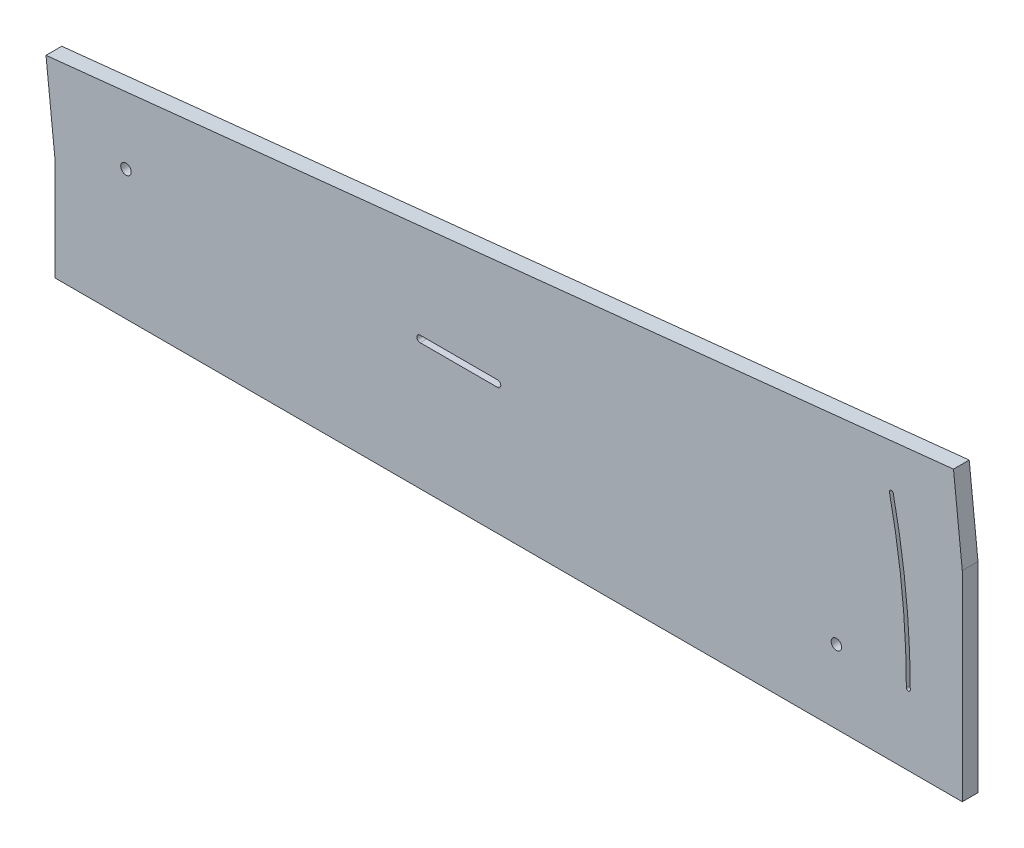
ISO-10303-21;
HEADER;
FILE_DESCRIPTION(('STEP AP214'),'2;1');
FILE_NAME('part.step','',(''),(''),'','','');
FILE_SCHEMA(('AUTOMOTIVE_DESIGN { 1 0 10303 214 1 1 1 1 }'));
ENDSEC;
DATA;
#1=APPLICATION_CONTEXT('core data for automotive mechanical design processes');
#2=APPLICATION_PROTOCOL_DEFINITION('international standard','automotive_design',2000,#1);
#3=PRODUCT_CONTEXT('',#1,'mechanical');
#4=PRODUCT('Part','Part','',(#3));
#5=PRODUCT_RELATED_PRODUCT_CATEGORY('part','',(#4));
#6=PRODUCT_DEFINITION_FORMATION('','',#4);
#7=PRODUCT_DEFINITION_CONTEXT('part definition',#1,'design');
#8=PRODUCT_DEFINITION('design','',#6,#7);
#9=PRODUCT_DEFINITION_SHAPE('','',#8);
#10=(LENGTH_UNIT() NAMED_UNIT(*) SI_UNIT(.MILLI.,.METRE.));
#11=(NAMED_UNIT(*) PLANE_ANGLE_UNIT() SI_UNIT($,.RADIAN.));
#12=(NAMED_UNIT(*) SI_UNIT($,.STERADIAN.) SOLID_ANGLE_UNIT());
#13=UNCERTAINTY_MEASURE_WITH_UNIT(LENGTH_MEASURE(1.E-05),#10,'distance_accuracy_value','');
#14=(GEOMETRIC_REPRESENTATION_CONTEXT(3) GLOBAL_UNCERTAINTY_ASSIGNED_CONTEXT((#13)) GLOBAL_UNIT_ASSIGNED_CONTEXT((#10,
#11,#12)) REPRESENTATION_CONTEXT('',''));
#15=CARTESIAN_POINT('',(0.,0.,0.));
#16=DIRECTION('',(0.,0.,1.));
#17=DIRECTION('',(1.,0.,0.));
#18=AXIS2_PLACEMENT_3D('',#15,#16,#17);
#19=CARTESIAN_POINT('',(0.,127.,19.05));
#20=DIRECTION('',(0.994521895368274,0.104528463267649,0.));
#21=DIRECTION('',(-0.104528463267649,0.994521895368274,0.));
#22=AXIS2_PLACEMENT_3D('',#19,#20,#21);
#23=PLANE('',#22);
#24=DIRECTION('',(0.104528463267649,-0.994521895368274,0.));
#25=VECTOR('',#24,1.);
#26=CARTESIAN_POINT('',(0.,127.,0.));
#27=LINE('',#26,#25);
#28=CARTESIAN_POINT('',(-10.6200918679931,228.043424569416,0.));
#29=VERTEX_POINT('',#28);
#30=CARTESIAN_POINT('',(0.,127.,0.));
#31=VERTEX_POINT('',#30);
#32=EDGE_CURVE('E229',#29,#31,#27,.T.);
#33=ORIENTED_EDGE('',*,*,#32,.T.);
#34=DIRECTION('',(0.,0.,-1.));
#35=VECTOR('',#34,1.);
#36=CARTESIAN_POINT('',(0.,127.,19.05));
#37=LINE('',#36,#35);
#38=CARTESIAN_POINT('',(0.,127.,19.05));
#39=VERTEX_POINT('',#38);
#40=EDGE_CURVE('E11',#39,#31,#37,.T.);
#41=ORIENTED_EDGE('',*,*,#40,.F.);
#42=DIRECTION('',(0.104528463267649,-0.994521895368274,0.));
#43=VECTOR('',#42,1.);
#44=CARTESIAN_POINT('',(0.,127.,19.05));
#45=LINE('',#44,#43);
#46=CARTESIAN_POINT('',(-10.6200918679931,228.043424569416,19.05));
#47=VERTEX_POINT('',#46);
#48=EDGE_CURVE('E245',#47,#39,#45,.T.);
#49=ORIENTED_EDGE('',*,*,#48,.F.);
#50=DIRECTION('',(0.,0.,-1.));
#51=VECTOR('',#50,1.);
#52=CARTESIAN_POINT('',(-10.6200918679931,228.043424569416,19.05));
#53=LINE('',#52,#51);
#54=EDGE_CURVE('E265',#47,#29,#53,.T.);
#55=ORIENTED_EDGE('',*,*,#54,.T.);
#56=EDGE_LOOP('',(#33,#41,#49,#55));
#57=FACE_BOUND('',#56,.T.);
#58=ADVANCED_FACE('F39',(#57),#23,.F.);
#59=CARTESIAN_POINT('',(0.,127.,19.05));
#60=DIRECTION('',(1.,0.,0.));
#61=DIRECTION('',(0.,1.,0.));
#62=AXIS2_PLACEMENT_3D('',#59,#60,#61);
#63=PLANE('',#62);
#64=DIRECTION('',(0.,-1.,0.));
#65=VECTOR('',#64,1.);
#66=CARTESIAN_POINT('',(0.,127.,0.));
#67=LINE('',#66,#65);
#68=CARTESIAN_POINT('',(0.,0.,0.));
#69=VERTEX_POINT('',#68);
#70=EDGE_CURVE('E269',#31,#69,#67,.T.);
#71=ORIENTED_EDGE('',*,*,#70,.T.);
#72=DIRECTION('',(0.,0.,-1.));
#73=VECTOR('',#72,1.);
#74=CARTESIAN_POINT('',(0.,0.,19.05));
#75=LINE('',#74,#73);
#76=CARTESIAN_POINT('',(0.,0.,19.05));
#77=VERTEX_POINT('',#76);
#78=EDGE_CURVE('E47',#77,#69,#75,.T.);
#79=ORIENTED_EDGE('',*,*,#78,.F.);
#80=DIRECTION('',(0.,-1.,0.));
#81=VECTOR('',#80,1.);
#82=CARTESIAN_POINT('',(0.,127.,19.05));
#83=LINE('',#82,#81);
#84=EDGE_CURVE('E249',#39,#77,#83,.T.);
#85=ORIENTED_EDGE('',*,*,#84,.F.);
#86=ORIENTED_EDGE('',*,*,#40,.T.);
#87=EDGE_LOOP('',(#71,#79,#85,#86));
#88=FACE_BOUND('',#87,.T.);
#89=ADVANCED_FACE('F325',(#88),#63,.F.);
#90=CARTESIAN_POINT('',(0.,0.,19.05));
#91=DIRECTION('',(0.,1.,0.));
#92=DIRECTION('',(0.,0.,1.));
#93=AXIS2_PLACEMENT_3D('',#90,#91,#92);
#94=PLANE('',#93);
#95=DIRECTION('',(1.,0.,0.));
#96=VECTOR('',#95,1.);
#97=CARTESIAN_POINT('',(0.,0.,0.));
#98=LINE('',#97,#96);
#99=CARTESIAN_POINT('',(1098.84724219241,0.,0.));
#100=VERTEX_POINT('',#99);
#101=EDGE_CURVE('E272',#69,#100,#98,.T.);
#102=ORIENTED_EDGE('',*,*,#101,.T.);
#103=DIRECTION('',(0.,0.,-1.));
#104=VECTOR('',#103,1.);
#105=CARTESIAN_POINT('',(1098.84724219241,0.,19.05));
#106=LINE('',#105,#104);
#107=CARTESIAN_POINT('',(1098.84724219241,0.,19.05));
#108=VERTEX_POINT('',#107);
#109=EDGE_CURVE('E294',#108,#100,#106,.T.);
#110=ORIENTED_EDGE('',*,*,#109,.F.);
#111=DIRECTION('',(1.,0.,0.));
#112=VECTOR('',#111,1.);
#113=CARTESIAN_POINT('',(0.,0.,19.05));
#114=LINE('',#113,#112);
#115=EDGE_CURVE('E253',#77,#108,#114,.T.);
#116=ORIENTED_EDGE('',*,*,#115,.F.);
#117=ORIENTED_EDGE('',*,*,#78,.T.);
#118=EDGE_LOOP('',(#102,#110,#116,#117));
#119=FACE_BOUND('',#118,.T.);
#120=ADVANCED_FACE('F303',(#119),#94,.F.);
#121=CARTESIAN_POINT('',(1098.84724219241,0.,19.05));
#122=DIRECTION('',(-1.,0.,0.));
#123=DIRECTION('',(0.,-1.,0.));
#124=AXIS2_PLACEMENT_3D('',#121,#122,#123);
#125=PLANE('',#124);
#126=DIRECTION('',(0.,1.,0.));
#127=VECTOR('',#126,1.);
#128=CARTESIAN_POINT('',(1098.84724219241,0.,0.));
#129=LINE('',#128,#127);
#130=CARTESIAN_POINT('',(1098.84724219241,242.493499064423,0.));
#131=VERTEX_POINT('',#130);
#132=EDGE_CURVE('E275',#100,#131,#129,.T.);
#133=ORIENTED_EDGE('',*,*,#132,.T.);
#134=DIRECTION('',(0.,0.,-1.));
#135=VECTOR('',#134,1.);
#136=CARTESIAN_POINT('',(1098.84724219241,242.493499064423,19.05));
#137=LINE('',#136,#135);
#138=CARTESIAN_POINT('',(1098.84724219241,242.493499064423,19.05));
#139=VERTEX_POINT('',#138);
#140=EDGE_CURVE('E290',#139,#131,#137,.T.);
#141=ORIENTED_EDGE('',*,*,#140,.F.);
#142=DIRECTION('',(0.,1.,0.));
#143=VECTOR('',#142,1.);
#144=CARTESIAN_POINT('',(1098.84724219241,0.,19.05));
#145=LINE('',#144,#143);
#146=EDGE_CURVE('E256',#108,#139,#145,.T.);
#147=ORIENTED_EDGE('',*,*,#146,.F.);
#148=ORIENTED_EDGE('',*,*,#109,.T.);
#149=EDGE_LOOP('',(#133,#141,#147,#148));
#150=FACE_BOUND('',#149,.T.);
#151=ADVANCED_FACE('F313',(#150),#125,.F.);
#152=CARTESIAN_POINT('',(1088.22715032441,343.536923633839,19.05));
#153=DIRECTION('',(-0.994521895368274,-0.104528463267642,0.));
#154=DIRECTION('',(0.104528463267642,-0.994521895368275,0.));
#155=AXIS2_PLACEMENT_3D('',#152,#153,#154);
#156=PLANE('',#155);
#157=DIRECTION('',(-0.104528463267642,0.994521895368275,0.));
#158=VECTOR('',#157,1.);
#159=CARTESIAN_POINT('',(1088.22715032441,343.536923633839,0.));
#160=LINE('',#159,#158);
#161=CARTESIAN_POINT('',(1088.22715032441,343.536923633839,0.));
#162=VERTEX_POINT('',#161);
#163=EDGE_CURVE('E278',#131,#162,#160,.T.);
#164=ORIENTED_EDGE('',*,*,#163,.T.);
#165=DIRECTION('',(0.,0.,-1.));
#166=VECTOR('',#165,1.);
#167=CARTESIAN_POINT('',(1088.22715032441,343.536923633839,19.05));
#168=LINE('',#167,#166);
#169=CARTESIAN_POINT('',(1088.22715032441,343.536923633839,19.05));
#170=VERTEX_POINT('',#169);
#171=EDGE_CURVE('E286',#170,#162,#168,.T.);
#172=ORIENTED_EDGE('',*,*,#171,.F.);
#173=DIRECTION('',(-0.104528463267642,0.994521895368275,0.));
#174=VECTOR('',#173,1.);
#175=CARTESIAN_POINT('',(1088.22715032441,343.536923633839,19.05));
#176=LINE('',#175,#174);
#177=EDGE_CURVE('E259',#139,#170,#176,.T.);
#178=ORIENTED_EDGE('',*,*,#177,.F.);
#179=ORIENTED_EDGE('',*,*,#140,.T.);
#180=EDGE_LOOP('',(#164,#172,#178,#179));
#181=FACE_BOUND('',#180,.T.);
#182=ADVANCED_FACE('F317',(#181),#156,.F.);
#183=CARTESIAN_POINT('',(-10.6200918679931,228.043424569416,19.05));
#184=DIRECTION('',(0.104528463267647,-0.994521895368274,0.));
#185=DIRECTION('',(0.994521895368274,0.104528463267647,0.));
#186=AXIS2_PLACEMENT_3D('',#183,#184,#185);
#187=PLANE('',#186);
#188=DIRECTION('',(-0.994521895368274,-0.104528463267647,0.));
#189=VECTOR('',#188,1.);
#190=CARTESIAN_POINT('',(-10.6200918679931,228.043424569416,0.));
#191=LINE('',#190,#189);
#192=EDGE_CURVE('E250',#162,#29,#191,.T.);
#193=ORIENTED_EDGE('',*,*,#192,.T.);
#194=ORIENTED_EDGE('',*,*,#54,.F.);
#195=DIRECTION('',(-0.994521895368274,-0.104528463267647,0.));
#196=VECTOR('',#195,1.);
#197=CARTESIAN_POINT('',(-10.6200918679931,228.043424569416,19.05));
#198=LINE('',#197,#196);
#199=EDGE_CURVE('E262',#170,#47,#198,.T.);
#200=ORIENTED_EDGE('',*,*,#199,.F.);
#201=ORIENTED_EDGE('',*,*,#171,.T.);
#202=EDGE_LOOP('',(#193,#194,#200,#201));
#203=FACE_BOUND('',#202,.T.);
#204=ADVANCED_FACE('F328',(#203),#187,.F.);
#205=CARTESIAN_POINT('',(0.,0.,19.05));
#206=DIRECTION('',(0.,0.,-1.));
#207=DIRECTION('',(-1.,0.,0.));
#208=AXIS2_PLACEMENT_3D('',#205,#206,#207);
#209=PLANE('',#208);
#210=CARTESIAN_POINT('',(946.447242192406,88.9,19.05));
#211=DIRECTION('',(0.,0.,1.));
#212=DIRECTION('',(1.,0.,0.));
#213=AXIS2_PLACEMENT_3D('',#210,#211,#212);
#214=CIRCLE('',#213,6.34999999999994);
#215=CARTESIAN_POINT('',(952.797242192406,88.9,19.05));
#216=VERTEX_POINT('',#215);
#217=EDGE_CURVE('E168',#216,#216,#214,.T.);
#218=ORIENTED_EDGE('',*,*,#217,.F.);
#219=EDGE_LOOP('',(#218));
#220=FACE_BOUND('',#219,.T.);
#221=CARTESIAN_POINT('',(93.7230424460677,85.7708681015491,19.05));
#222=DIRECTION('',(0.,0.,1.));
#223=DIRECTION('',(1.,0.,0.));
#224=AXIS2_PLACEMENT_3D('',#221,#222,#223);
#225=CIRCLE('',#224,942.181249986002);
#226=CARTESIAN_POINT('',(1035.90429243207,85.7708680997901,19.05));
#227=VERTEX_POINT('',#226);
#228=CARTESIAN_POINT('',(1015.31537157595,281.661364844353,19.05));
#229=VERTEX_POINT('',#228);
#230=EDGE_CURVE('E177',#227,#229,#225,.T.);
#231=ORIENTED_EDGE('',*,*,#230,.F.);
#232=CARTESIAN_POINT('',(1033.52304243207,85.7708680997943,19.05));
#233=DIRECTION('',(0.,0.,1.));
#234=DIRECTION('',(1.,0.,0.));
#235=AXIS2_PLACEMENT_3D('',#232,#233,#234);
#236=CIRCLE('',#235,2.38125);
#237=CARTESIAN_POINT('',(1031.14179243207,85.770868099799,19.05));
#238=VERTEX_POINT('',#237);
#239=EDGE_CURVE('E54',#238,#227,#236,.T.);
#240=ORIENTED_EDGE('',*,*,#239,.F.);
#241=CARTESIAN_POINT('',(93.7230424460677,85.7708681015491,19.05));
#242=DIRECTION('',(0.,0.,-1.));
#243=DIRECTION('',(1.,0.,0.));
#244=AXIS2_PLACEMENT_3D('',#241,#242,#243);
#245=CIRCLE('',#244,937.418749986002);
#246=CARTESIAN_POINT('',(1010.65694362746,280.671185416826,19.05));
#247=VERTEX_POINT('',#246);
#248=EDGE_CURVE('E161',#247,#238,#245,.T.);
#249=ORIENTED_EDGE('',*,*,#248,.F.);
#250=CARTESIAN_POINT('',(1012.9861576017,281.16627513059,19.05));
#251=DIRECTION('',(0.,0.,1.));
#252=DIRECTION('',(1.,0.,0.));
#253=AXIS2_PLACEMENT_3D('',#250,#251,#252);
#254=CIRCLE('',#253,2.38124999999997);
#255=EDGE_CURVE('E165',#229,#247,#254,.T.);
#256=ORIENTED_EDGE('',*,*,#255,.F.);
#257=EDGE_LOOP('',(#231,#240,#249,#256));
#258=FACE_BOUND('',#257,.T.);
#259=DIRECTION('',(1.,0.,0.));
#260=VECTOR('',#259,1.);
#261=CARTESIAN_POINT('',(442.415992192407,153.19375,19.05));
#262=LINE('',#261,#260);
#263=CARTESIAN_POINT('',(442.415992192407,153.19375,19.05));
#264=VERTEX_POINT('',#263);
#265=CARTESIAN_POINT('',(536.078492192406,153.19375,19.05));
#266=VERTEX_POINT('',#265);
#267=EDGE_CURVE('E214',#264,#266,#262,.T.);
#268=ORIENTED_EDGE('',*,*,#267,.F.);
#269=CARTESIAN_POINT('',(442.415992192407,157.1625,19.05));
#270=DIRECTION('',(0.,0.,1.));
#271=DIRECTION('',(1.,0.,0.));
#272=AXIS2_PLACEMENT_3D('',#269,#270,#271);
#273=CIRCLE('',#272,3.96874999999999);
#274=CARTESIAN_POINT('',(442.415992192407,161.13125,19.05));
#275=VERTEX_POINT('',#274);
#276=EDGE_CURVE('E211',#275,#264,#273,.T.);
#277=ORIENTED_EDGE('',*,*,#276,.F.);
#278=DIRECTION('',(-1.,0.,0.));
#279=VECTOR('',#278,1.);
#280=CARTESIAN_POINT('',(442.415992192407,161.13125,19.05));
#281=LINE('',#280,#279);
#282=CARTESIAN_POINT('',(536.078492192406,161.13125,19.05));
#283=VERTEX_POINT('',#282);
#284=EDGE_CURVE('E198',#283,#275,#281,.T.);
#285=ORIENTED_EDGE('',*,*,#284,.F.);
#286=CARTESIAN_POINT('',(536.078492192406,157.1625,19.05));
#287=DIRECTION('',(0.,0.,1.));
#288=DIRECTION('',(1.,0.,0.));
#289=AXIS2_PLACEMENT_3D('',#286,#287,#288);
#290=CIRCLE('',#289,3.96874999999999);
#291=EDGE_CURVE('E219',#266,#283,#290,.T.);
#292=ORIENTED_EDGE('',*,*,#291,.F.);
#293=EDGE_LOOP('',(#268,#277,#285,#292));
#294=FACE_BOUND('',#293,.T.);
#295=CARTESIAN_POINT('',(86.1972143573427,157.1625,19.05));
#296=DIRECTION('',(0.,0.,1.));
#297=DIRECTION('',(1.,0.,0.));
#298=AXIS2_PLACEMENT_3D('',#295,#296,#297);
#299=CIRCLE('',#298,6.34999999999999);
#300=CARTESIAN_POINT('',(92.5472143573427,157.1625,19.05));
#301=VERTEX_POINT('',#300);
#302=EDGE_CURVE('E187',#301,#301,#299,.T.);
#303=ORIENTED_EDGE('',*,*,#302,.F.);
#304=EDGE_LOOP('',(#303));
#305=FACE_BOUND('',#304,.T.);
#306=ORIENTED_EDGE('',*,*,#48,.T.);
#307=ORIENTED_EDGE('',*,*,#84,.T.);
#308=ORIENTED_EDGE('',*,*,#115,.T.);
#309=ORIENTED_EDGE('',*,*,#146,.T.);
#310=ORIENTED_EDGE('',*,*,#177,.T.);
#311=ORIENTED_EDGE('',*,*,#199,.T.);
#312=EDGE_LOOP('',(#306,#307,#308,#309,#310,#311));
#313=FACE_BOUND('',#312,.T.);
#314=ADVANCED_FACE('F321',(#220,#258,#294,#305,#313),#209,.F.);
#315=CARTESIAN_POINT('',(0.,0.,0.));
#316=DIRECTION('',(0.,0.,-1.));
#317=DIRECTION('',(-1.,0.,0.));
#318=AXIS2_PLACEMENT_3D('',#315,#316,#317);
#319=PLANE('',#318);
#320=CARTESIAN_POINT('',(946.447242192406,88.9,0.));
#321=DIRECTION('',(0.,0.,1.));
#322=DIRECTION('',(1.,0.,0.));
#323=AXIS2_PLACEMENT_3D('',#320,#321,#322);
#324=CIRCLE('',#323,6.34999999999994);
#325=CARTESIAN_POINT('',(952.797242192406,88.9,0.));
#326=VERTEX_POINT('',#325);
#327=EDGE_CURVE('E178',#326,#326,#324,.T.);
#328=ORIENTED_EDGE('',*,*,#327,.T.);
#329=EDGE_LOOP('',(#328));
#330=FACE_BOUND('',#329,.T.);
#331=CARTESIAN_POINT('',(1033.52304243207,85.7708680997943,0.));
#332=DIRECTION('',(0.,0.,1.));
#333=DIRECTION('',(1.,0.,0.));
#334=AXIS2_PLACEMENT_3D('',#331,#332,#333);
#335=CIRCLE('',#334,2.38125);
#336=CARTESIAN_POINT('',(1031.14179243207,85.770868099799,0.));
#337=VERTEX_POINT('',#336);
#338=CARTESIAN_POINT('',(1035.90429243207,85.7708680997901,0.));
#339=VERTEX_POINT('',#338);
#340=EDGE_CURVE('E142',#337,#339,#335,.T.);
#341=ORIENTED_EDGE('',*,*,#340,.T.);
#342=CARTESIAN_POINT('',(93.7230424460677,85.7708681015491,0.));
#343=DIRECTION('',(0.,0.,1.));
#344=DIRECTION('',(1.,0.,0.));
#345=AXIS2_PLACEMENT_3D('',#342,#343,#344);
#346=CIRCLE('',#345,942.181249986002);
#347=CARTESIAN_POINT('',(1015.31537157595,281.661364844353,0.));
#348=VERTEX_POINT('',#347);
#349=EDGE_CURVE('E152',#339,#348,#346,.T.);
#350=ORIENTED_EDGE('',*,*,#349,.T.);
#351=CARTESIAN_POINT('',(1012.9861576017,281.16627513059,0.));
#352=DIRECTION('',(0.,0.,1.));
#353=DIRECTION('',(1.,0.,0.));
#354=AXIS2_PLACEMENT_3D('',#351,#352,#353);
#355=CIRCLE('',#354,2.38124999999997);
#356=CARTESIAN_POINT('',(1010.65694362746,280.671185416826,0.));
#357=VERTEX_POINT('',#356);
#358=EDGE_CURVE('E62',#348,#357,#355,.T.);
#359=ORIENTED_EDGE('',*,*,#358,.T.);
#360=CARTESIAN_POINT('',(93.7230424460677,85.7708681015491,0.));
#361=DIRECTION('',(0.,0.,-1.));
#362=DIRECTION('',(1.,0.,0.));
#363=AXIS2_PLACEMENT_3D('',#360,#361,#362);
#364=CIRCLE('',#363,937.418749986002);
#365=EDGE_CURVE('E149',#357,#337,#364,.T.);
#366=ORIENTED_EDGE('',*,*,#365,.T.);
#367=EDGE_LOOP('',(#341,#350,#359,#366));
#368=FACE_BOUND('',#367,.T.);
#369=CARTESIAN_POINT('',(442.415992192407,157.1625,0.));
#370=DIRECTION('',(0.,0.,1.));
#371=DIRECTION('',(1.,0.,0.));
#372=AXIS2_PLACEMENT_3D('',#369,#370,#371);
#373=CIRCLE('',#372,3.96874999999999);
#374=CARTESIAN_POINT('',(442.415992192407,161.13125,0.));
#375=VERTEX_POINT('',#374);
#376=CARTESIAN_POINT('',(442.415992192407,153.19375,0.));
#377=VERTEX_POINT('',#376);
#378=EDGE_CURVE('E193',#375,#377,#373,.T.);
#379=ORIENTED_EDGE('',*,*,#378,.T.);
#380=DIRECTION('',(1.,0.,0.));
#381=VECTOR('',#380,1.);
#382=CARTESIAN_POINT('',(442.415992192407,153.19375,0.));
#383=LINE('',#382,#381);
#384=CARTESIAN_POINT('',(536.078492192406,153.19375,0.));
#385=VERTEX_POINT('',#384);
#386=EDGE_CURVE('E197',#377,#385,#383,.T.);
#387=ORIENTED_EDGE('',*,*,#386,.T.);
#388=CARTESIAN_POINT('',(536.078492192406,157.1625,0.));
#389=DIRECTION('',(0.,0.,1.));
#390=DIRECTION('',(1.,0.,0.));
#391=AXIS2_PLACEMENT_3D('',#388,#389,#390);
#392=CIRCLE('',#391,3.96874999999999);
#393=CARTESIAN_POINT('',(536.078492192406,161.13125,0.));
#394=VERTEX_POINT('',#393);
#395=EDGE_CURVE('E202',#385,#394,#392,.T.);
#396=ORIENTED_EDGE('',*,*,#395,.T.);
#397=DIRECTION('',(-1.,0.,0.));
#398=VECTOR('',#397,1.);
#399=CARTESIAN_POINT('',(442.415992192407,161.13125,0.));
#400=LINE('',#399,#398);
#401=EDGE_CURVE('E206',#394,#375,#400,.T.);
#402=ORIENTED_EDGE('',*,*,#401,.T.);
#403=EDGE_LOOP('',(#379,#387,#396,#402));
#404=FACE_BOUND('',#403,.T.);
#405=CARTESIAN_POINT('',(86.1972143573427,157.1625,0.));
#406=DIRECTION('',(0.,0.,1.));
#407=DIRECTION('',(1.,0.,0.));
#408=AXIS2_PLACEMENT_3D('',#405,#406,#407);
#409=CIRCLE('',#408,6.34999999999999);
#410=CARTESIAN_POINT('',(92.5472143573427,157.1625,0.));
#411=VERTEX_POINT('',#410);
#412=EDGE_CURVE('E215',#411,#411,#409,.T.);
#413=ORIENTED_EDGE('',*,*,#412,.T.);
#414=EDGE_LOOP('',(#413));
#415=FACE_BOUND('',#414,.T.);
#416=ORIENTED_EDGE('',*,*,#32,.F.);
#417=ORIENTED_EDGE('',*,*,#192,.F.);
#418=ORIENTED_EDGE('',*,*,#163,.F.);
#419=ORIENTED_EDGE('',*,*,#132,.F.);
#420=ORIENTED_EDGE('',*,*,#101,.F.);
#421=ORIENTED_EDGE('',*,*,#70,.F.);
#422=EDGE_LOOP('',(#416,#417,#418,#419,#420,#421));
#423=FACE_BOUND('',#422,.T.);
#424=ADVANCED_FACE('F157',(#330,#368,#404,#415,#423),#319,.T.);
#425=CARTESIAN_POINT('',(86.1972143573427,157.1625,0.));
#426=DIRECTION('',(0.,0.,1.));
#427=DIRECTION('',(1.,0.,0.));
#428=AXIS2_PLACEMENT_3D('',#425,#426,#427);
#429=CYLINDRICAL_SURFACE('',#428,6.34999999999999);
#430=CARTESIAN_POINT('',(92.5472143573427,157.1625,0.));
#431=CARTESIAN_POINT('',(92.5472143573427,157.1625,0.1984375));
#432=CARTESIAN_POINT('',(92.5472143573427,157.1625,0.396875));
#433=CARTESIAN_POINT('',(92.5472143573427,157.1625,0.79375));
#434=CARTESIAN_POINT('',(92.5472143573427,157.1625,0.9921875));
#435=CARTESIAN_POINT('',(92.5472143573427,157.1625,1.3890625));
#436=CARTESIAN_POINT('',(92.5472143573427,157.1625,1.5875));
#437=CARTESIAN_POINT('',(92.5472143573427,157.1625,1.984375));
#438=CARTESIAN_POINT('',(92.5472143573427,157.1625,2.1828125));
#439=CARTESIAN_POINT('',(92.5472143573427,157.1625,2.5796875));
#440=CARTESIAN_POINT('',(92.5472143573427,157.1625,2.778125));
#441=CARTESIAN_POINT('',(92.5472143573427,157.1625,3.175));
#442=CARTESIAN_POINT('',(92.5472143573427,157.1625,3.3734375));
#443=CARTESIAN_POINT('',(92.5472143573427,157.1625,3.7703125));
#444=CARTESIAN_POINT('',(92.5472143573427,157.1625,3.96875));
#445=CARTESIAN_POINT('',(92.5472143573427,157.1625,4.365625));
#446=CARTESIAN_POINT('',(92.5472143573427,157.1625,4.5640625));
#447=CARTESIAN_POINT('',(92.5472143573427,157.1625,4.9609375));
#448=CARTESIAN_POINT('',(92.5472143573427,157.1625,5.159375));
#449=CARTESIAN_POINT('',(92.5472143573427,157.1625,5.55625));
#450=CARTESIAN_POINT('',(92.5472143573427,157.1625,5.7546875));
#451=CARTESIAN_POINT('',(92.5472143573427,157.1625,6.1515625));
#452=CARTESIAN_POINT('',(92.5472143573427,157.1625,6.35));
#453=CARTESIAN_POINT('',(92.5472143573427,157.1625,6.746875));
#454=CARTESIAN_POINT('',(92.5472143573427,157.1625,6.9453125));
#455=CARTESIAN_POINT('',(92.5472143573427,157.1625,7.3421875));
#456=CARTESIAN_POINT('',(92.5472143573427,157.1625,7.540625));
#457=CARTESIAN_POINT('',(92.5472143573427,157.1625,7.9375));
#458=CARTESIAN_POINT('',(92.5472143573427,157.1625,8.1359375));
#459=CARTESIAN_POINT('',(92.5472143573427,157.1625,8.5328125));
#460=CARTESIAN_POINT('',(92.5472143573427,157.1625,8.73125));
#461=CARTESIAN_POINT('',(92.5472143573427,157.1625,9.128125));
#462=CARTESIAN_POINT('',(92.5472143573427,157.1625,9.3265625));
#463=CARTESIAN_POINT('',(92.5472143573427,157.1625,9.7234375));
#464=CARTESIAN_POINT('',(92.5472143573427,157.1625,9.921875));
#465=CARTESIAN_POINT('',(92.5472143573427,157.1625,10.31875));
#466=CARTESIAN_POINT('',(92.5472143573427,157.1625,10.5171875));
#467=CARTESIAN_POINT('',(92.5472143573427,157.1625,10.9140625));
#468=CARTESIAN_POINT('',(92.5472143573427,157.1625,11.1125));
#469=CARTESIAN_POINT('',(92.5472143573427,157.1625,11.509375));
#470=CARTESIAN_POINT('',(92.5472143573427,157.1625,11.7078125));
#471=CARTESIAN_POINT('',(92.5472143573427,157.1625,12.1046875));
#472=CARTESIAN_POINT('',(92.5472143573427,157.1625,12.303125));
#473=CARTESIAN_POINT('',(92.5472143573427,157.1625,12.7));
#474=CARTESIAN_POINT('',(92.5472143573427,157.1625,12.8984375));
#475=CARTESIAN_POINT('',(92.5472143573427,157.1625,13.2953125));
#476=CARTESIAN_POINT('',(92.5472143573427,157.1625,13.49375));
#477=CARTESIAN_POINT('',(92.5472143573427,157.1625,13.890625));
#478=CARTESIAN_POINT('',(92.5472143573427,157.1625,14.0890625));
#479=CARTESIAN_POINT('',(92.5472143573427,157.1625,14.4859375));
#480=CARTESIAN_POINT('',(92.5472143573427,157.1625,14.684375));
#481=CARTESIAN_POINT('',(92.5472143573427,157.1625,15.08125));
#482=CARTESIAN_POINT('',(92.5472143573427,157.1625,15.2796875));
#483=CARTESIAN_POINT('',(92.5472143573427,157.1625,15.6765625));
#484=CARTESIAN_POINT('',(92.5472143573427,157.1625,15.875));
#485=CARTESIAN_POINT('',(92.5472143573427,157.1625,16.271875));
#486=CARTESIAN_POINT('',(92.5472143573427,157.1625,16.4703125));
#487=CARTESIAN_POINT('',(92.5472143573427,157.1625,16.8671875));
#488=CARTESIAN_POINT('',(92.5472143573427,157.1625,17.065625));
#489=CARTESIAN_POINT('',(92.5472143573427,157.1625,17.4625));
#490=CARTESIAN_POINT('',(92.5472143573427,157.1625,17.6609375));
#491=CARTESIAN_POINT('',(92.5472143573427,157.1625,18.0578125));
#492=CARTESIAN_POINT('',(92.5472143573427,157.1625,18.25625));
#493=CARTESIAN_POINT('',(92.5472143573427,157.1625,18.653125));
#494=CARTESIAN_POINT('',(92.5472143573427,157.1625,18.8515625));
#495=CARTESIAN_POINT('',(92.5472143573427,157.1625,19.05));
#496=B_SPLINE_CURVE_WITH_KNOTS('',3,(#430,#431,#432,#433,#434,#435,#436,#437,#438,#439,#440,
#441,#442,#443,#444,#445,#446,#447,#448,#449,#450,#451,#452,#453,#454,#455,#456,#457,#458,#459,
#460,#461,#462,#463,#464,#465,#466,#467,#468,#469,#470,#471,#472,#473,#474,#475,#476,#477,#478,
#479,#480,#481,#482,#483,#484,#485,#486,#487,#488,#489,#490,#491,#492,#493,#494,#495),
.UNSPECIFIED.,.F.,.F.,(4,2,2,2,2,2,2,2,2,2,2,2,2,2,2,2,2,2,2,2,2,2,2,2,2,2,2,2,2,2,2,2,4),(0.,
0.5953125,1.190625,1.7859375,2.38125,2.9765625,3.571875,4.1671875,4.7625,5.3578125,5.953125,
6.5484375,7.14375,7.7390625,8.334375,8.9296875,9.525,10.1203125,10.715625,11.3109375,11.90625,
12.5015625,13.096875,13.6921875,14.2875,14.8828125,15.478125,16.0734375,16.66875,17.2640625,
17.859375,18.4546875,19.05),.UNSPECIFIED.);
#497=EDGE_CURVE('BSEAM367',#411,#301,#496,.T.);
#498=ORIENTED_EDGE('',*,*,#412,.F.);
#499=ORIENTED_EDGE('',*,*,#302,.T.);
#500=ORIENTED_EDGE('',*,*,#497,.T.);
#501=ORIENTED_EDGE('',*,*,#497,.F.);
#502=EDGE_LOOP('',(#498,#500,#499,#501));
#503=FACE_BOUND('',#502,.T.);
#504=ADVANCED_FACE('F367',(#503),#429,.F.);
#505=CARTESIAN_POINT('',(442.415992192407,157.1625,0.));
#506=DIRECTION('',(0.,0.,1.));
#507=DIRECTION('',(1.,0.,0.));
#508=AXIS2_PLACEMENT_3D('',#505,#506,#507);
#509=CYLINDRICAL_SURFACE('',#508,3.96874999999999);
#510=ORIENTED_EDGE('',*,*,#276,.T.);
#511=DIRECTION('',(0.,0.,1.));
#512=VECTOR('',#511,1.);
#513=CARTESIAN_POINT('',(442.415992192407,153.19375,0.));
#514=LINE('',#513,#512);
#515=EDGE_CURVE('E210',#377,#264,#514,.T.);
#516=ORIENTED_EDGE('',*,*,#515,.F.);
#517=ORIENTED_EDGE('',*,*,#378,.F.);
#518=DIRECTION('',(0.,0.,1.));
#519=VECTOR('',#518,1.);
#520=CARTESIAN_POINT('',(442.415992192407,161.13125,0.));
#521=LINE('',#520,#519);
#522=EDGE_CURVE('E226',#375,#275,#521,.T.);
#523=ORIENTED_EDGE('',*,*,#522,.T.);
#524=EDGE_LOOP('',(#510,#516,#517,#523));
#525=FACE_BOUND('',#524,.T.);
#526=ADVANCED_FACE('F372',(#525),#509,.F.);
#527=CARTESIAN_POINT('',(442.415992192407,161.13125,0.));
#528=DIRECTION('',(0.,1.,0.));
#529=DIRECTION('',(0.,0.,1.));
#530=AXIS2_PLACEMENT_3D('',#527,#528,#529);
#531=PLANE('',#530);
#532=ORIENTED_EDGE('',*,*,#284,.T.);
#533=ORIENTED_EDGE('',*,*,#522,.F.);
#534=ORIENTED_EDGE('',*,*,#401,.F.);
#535=DIRECTION('',(0.,0.,1.));
#536=VECTOR('',#535,1.);
#537=CARTESIAN_POINT('',(536.078492192406,161.13125,0.));
#538=LINE('',#537,#536);
#539=EDGE_CURVE('E230',#394,#283,#538,.T.);
#540=ORIENTED_EDGE('',*,*,#539,.T.);
#541=EDGE_LOOP('',(#532,#533,#534,#540));
#542=FACE_BOUND('',#541,.T.);
#543=ADVANCED_FACE('F384',(#542),#531,.F.);
#544=CARTESIAN_POINT('',(536.078492192406,157.1625,0.));
#545=DIRECTION('',(0.,0.,1.));
#546=DIRECTION('',(1.,0.,0.));
#547=AXIS2_PLACEMENT_3D('',#544,#545,#546);
#548=CYLINDRICAL_SURFACE('',#547,3.96874999999999);
#549=ORIENTED_EDGE('',*,*,#291,.T.);
#550=ORIENTED_EDGE('',*,*,#539,.F.);
#551=ORIENTED_EDGE('',*,*,#395,.F.);
#552=DIRECTION('',(0.,0.,1.));
#553=VECTOR('',#552,1.);
#554=CARTESIAN_POINT('',(536.078492192406,153.19375,0.));
#555=LINE('',#554,#553);
#556=EDGE_CURVE('E233',#385,#266,#555,.T.);
#557=ORIENTED_EDGE('',*,*,#556,.T.);
#558=EDGE_LOOP('',(#549,#550,#551,#557));
#559=FACE_BOUND('',#558,.T.);
#560=ADVANCED_FACE('F394',(#559),#548,.F.);
#561=CARTESIAN_POINT('',(442.415992192407,153.19375,0.));
#562=DIRECTION('',(0.,-1.,0.));
#563=DIRECTION('',(0.,0.,-1.));
#564=AXIS2_PLACEMENT_3D('',#561,#562,#563);
#565=PLANE('',#564);
#566=ORIENTED_EDGE('',*,*,#267,.T.);
#567=ORIENTED_EDGE('',*,*,#556,.F.);
#568=ORIENTED_EDGE('',*,*,#386,.F.);
#569=ORIENTED_EDGE('',*,*,#515,.T.);
#570=EDGE_LOOP('',(#566,#567,#568,#569));
#571=FACE_BOUND('',#570,.T.);
#572=ADVANCED_FACE('F404',(#571),#565,.F.);
#573=CARTESIAN_POINT('',(1033.52304243207,85.7708680997943,0.));
#574=DIRECTION('',(0.,0.,1.));
#575=DIRECTION('',(1.,0.,0.));
#576=AXIS2_PLACEMENT_3D('',#573,#574,#575);
#577=CYLINDRICAL_SURFACE('',#576,2.38125);
#578=ORIENTED_EDGE('',*,*,#239,.T.);
#579=DIRECTION('',(0.,0.,1.));
#580=VECTOR('',#579,1.);
#581=CARTESIAN_POINT('',(1035.90429243207,85.7708680997901,0.));
#582=LINE('',#581,#580);
#583=EDGE_CURVE('E138',#339,#227,#582,.T.);
#584=ORIENTED_EDGE('',*,*,#583,.F.);
#585=ORIENTED_EDGE('',*,*,#340,.F.);
#586=DIRECTION('',(0.,0.,1.));
#587=VECTOR('',#586,1.);
#588=CARTESIAN_POINT('',(1031.14179243207,85.770868099799,0.));
#589=LINE('',#588,#587);
#590=EDGE_CURVE('E184',#337,#238,#589,.T.);
#591=ORIENTED_EDGE('',*,*,#590,.T.);
#592=EDGE_LOOP('',(#578,#584,#585,#591));
#593=FACE_BOUND('',#592,.T.);
#594=ADVANCED_FACE('F140',(#593),#577,.F.);
#595=CARTESIAN_POINT('',(93.7230424460677,85.7708681015491,0.));
#596=DIRECTION('',(0.,0.,1.));
#597=DIRECTION('',(1.,0.,0.));
#598=AXIS2_PLACEMENT_3D('',#595,#596,#597);
#599=CYLINDRICAL_SURFACE('',#598,937.418749986002);
#600=ORIENTED_EDGE('',*,*,#248,.T.);
#601=ORIENTED_EDGE('',*,*,#590,.F.);
#602=ORIENTED_EDGE('',*,*,#365,.F.);
#603=DIRECTION('',(0.,0.,1.));
#604=VECTOR('',#603,1.);
#605=CARTESIAN_POINT('',(1010.65694362746,280.671185416826,0.));
#606=LINE('',#605,#604);
#607=EDGE_CURVE('E188',#357,#247,#606,.T.);
#608=ORIENTED_EDGE('',*,*,#607,.T.);
#609=EDGE_LOOP('',(#600,#601,#602,#608));
#610=FACE_BOUND('',#609,.T.);
#611=ADVANCED_FACE('F423',(#610),#599,.T.);
#612=CARTESIAN_POINT('',(1012.9861576017,281.16627513059,0.));
#613=DIRECTION('',(0.,0.,1.));
#614=DIRECTION('',(1.,0.,0.));
#615=AXIS2_PLACEMENT_3D('',#612,#613,#614);
#616=CYLINDRICAL_SURFACE('',#615,2.38124999999997);
#617=ORIENTED_EDGE('',*,*,#255,.T.);
#618=ORIENTED_EDGE('',*,*,#607,.F.);
#619=ORIENTED_EDGE('',*,*,#358,.F.);
#620=DIRECTION('',(0.,0.,1.));
#621=VECTOR('',#620,1.);
#622=CARTESIAN_POINT('',(1015.31537157595,281.661364844353,0.));
#623=LINE('',#622,#621);
#624=EDGE_CURVE('E148',#348,#229,#623,.T.);
#625=ORIENTED_EDGE('',*,*,#624,.T.);
#626=EDGE_LOOP('',(#617,#618,#619,#625));
#627=FACE_BOUND('',#626,.T.);
#628=ADVANCED_FACE('F432',(#627),#616,.F.);
#629=CARTESIAN_POINT('',(93.7230424460677,85.7708681015491,0.));
#630=DIRECTION('',(0.,0.,1.));
#631=DIRECTION('',(1.,0.,0.));
#632=AXIS2_PLACEMENT_3D('',#629,#630,#631);
#633=CYLINDRICAL_SURFACE('',#632,942.181249986002);
#634=ORIENTED_EDGE('',*,*,#230,.T.);
#635=ORIENTED_EDGE('',*,*,#624,.F.);
#636=ORIENTED_EDGE('',*,*,#349,.F.);
#637=ORIENTED_EDGE('',*,*,#583,.T.);
#638=EDGE_LOOP('',(#634,#635,#636,#637));
#639=FACE_BOUND('',#638,.T.);
#640=ADVANCED_FACE('F153',(#639),#633,.F.);
#641=CARTESIAN_POINT('',(946.447242192406,88.9,0.));
#642=DIRECTION('',(0.,0.,1.));
#643=DIRECTION('',(1.,0.,0.));
#644=AXIS2_PLACEMENT_3D('',#641,#642,#643);
#645=CYLINDRICAL_SURFACE('',#644,6.34999999999994);
#646=CARTESIAN_POINT('',(952.797242192406,88.9,0.));
#647=CARTESIAN_POINT('',(952.797242192406,88.9,0.1984375));
#648=CARTESIAN_POINT('',(952.797242192406,88.9,0.396875));
#649=CARTESIAN_POINT('',(952.797242192406,88.9,0.79375));
#650=CARTESIAN_POINT('',(952.797242192406,88.9,0.9921875));
#651=CARTESIAN_POINT('',(952.797242192406,88.9,1.3890625));
#652=CARTESIAN_POINT('',(952.797242192406,88.9,1.5875));
#653=CARTESIAN_POINT('',(952.797242192406,88.9,1.984375));
#654=CARTESIAN_POINT('',(952.797242192406,88.9,2.1828125));
#655=CARTESIAN_POINT('',(952.797242192406,88.9,2.5796875));
#656=CARTESIAN_POINT('',(952.797242192406,88.9,2.778125));
#657=CARTESIAN_POINT('',(952.797242192406,88.9,3.175));
#658=CARTESIAN_POINT('',(952.797242192406,88.9,3.3734375));
#659=CARTESIAN_POINT('',(952.797242192406,88.9,3.7703125));
#660=CARTESIAN_POINT('',(952.797242192406,88.9,3.96875));
#661=CARTESIAN_POINT('',(952.797242192406,88.9,4.365625));
#662=CARTESIAN_POINT('',(952.797242192406,88.9,4.5640625));
#663=CARTESIAN_POINT('',(952.797242192406,88.9,4.9609375));
#664=CARTESIAN_POINT('',(952.797242192406,88.9,5.159375));
#665=CARTESIAN_POINT('',(952.797242192406,88.9,5.55625));
#666=CARTESIAN_POINT('',(952.797242192406,88.9,5.7546875));
#667=CARTESIAN_POINT('',(952.797242192406,88.9,6.1515625));
#668=CARTESIAN_POINT('',(952.797242192406,88.9,6.35));
#669=CARTESIAN_POINT('',(952.797242192406,88.9,6.746875));
#670=CARTESIAN_POINT('',(952.797242192406,88.9,6.9453125));
#671=CARTESIAN_POINT('',(952.797242192406,88.9,7.3421875));
#672=CARTESIAN_POINT('',(952.797242192406,88.9,7.540625));
#673=CARTESIAN_POINT('',(952.797242192406,88.9,7.9375));
#674=CARTESIAN_POINT('',(952.797242192406,88.9,8.1359375));
#675=CARTESIAN_POINT('',(952.797242192406,88.9,8.5328125));
#676=CARTESIAN_POINT('',(952.797242192406,88.9,8.73125));
#677=CARTESIAN_POINT('',(952.797242192406,88.9,9.128125));
#678=CARTESIAN_POINT('',(952.797242192406,88.9,9.3265625));
#679=CARTESIAN_POINT('',(952.797242192406,88.9,9.7234375));
#680=CARTESIAN_POINT('',(952.797242192406,88.9,9.921875));
#681=CARTESIAN_POINT('',(952.797242192406,88.9,10.31875));
#682=CARTESIAN_POINT('',(952.797242192406,88.9,10.5171875));
#683=CARTESIAN_POINT('',(952.797242192406,88.9,10.9140625));
#684=CARTESIAN_POINT('',(952.797242192406,88.9,11.1125));
#685=CARTESIAN_POINT('',(952.797242192406,88.9,11.509375));
#686=CARTESIAN_POINT('',(952.797242192406,88.9,11.7078125));
#687=CARTESIAN_POINT('',(952.797242192406,88.9,12.1046875));
#688=CARTESIAN_POINT('',(952.797242192406,88.9,12.303125));
#689=CARTESIAN_POINT('',(952.797242192406,88.9,12.7));
#690=CARTESIAN_POINT('',(952.797242192406,88.9,12.8984375));
#691=CARTESIAN_POINT('',(952.797242192406,88.9,13.2953125));
#692=CARTESIAN_POINT('',(952.797242192406,88.9,13.49375));
#693=CARTESIAN_POINT('',(952.797242192406,88.9,13.890625));
#694=CARTESIAN_POINT('',(952.797242192406,88.9,14.0890625));
#695=CARTESIAN_POINT('',(952.797242192406,88.9,14.4859375));
#696=CARTESIAN_POINT('',(952.797242192406,88.9,14.684375));
#697=CARTESIAN_POINT('',(952.797242192406,88.9,15.08125));
#698=CARTESIAN_POINT('',(952.797242192406,88.9,15.2796875));
#699=CARTESIAN_POINT('',(952.797242192406,88.9,15.6765625));
#700=CARTESIAN_POINT('',(952.797242192406,88.9,15.875));
#701=CARTESIAN_POINT('',(952.797242192406,88.9,16.271875));
#702=CARTESIAN_POINT('',(952.797242192406,88.9,16.4703125));
#703=CARTESIAN_POINT('',(952.797242192406,88.9,16.8671875));
#704=CARTESIAN_POINT('',(952.797242192406,88.9,17.065625));
#705=CARTESIAN_POINT('',(952.797242192406,88.9,17.4625));
#706=CARTESIAN_POINT('',(952.797242192406,88.9,17.6609375));
#707=CARTESIAN_POINT('',(952.797242192406,88.9,18.0578125));
#708=CARTESIAN_POINT('',(952.797242192406,88.9,18.25625));
#709=CARTESIAN_POINT('',(952.797242192406,88.9,18.653125));
#710=CARTESIAN_POINT('',(952.797242192406,88.9,18.8515625));
#711=CARTESIAN_POINT('',(952.797242192406,88.9,19.05));
#712=B_SPLINE_CURVE_WITH_KNOTS('',3,(#646,#647,#648,#649,#650,#651,#652,#653,#654,#655,#656,
#657,#658,#659,#660,#661,#662,#663,#664,#665,#666,#667,#668,#669,#670,#671,#672,#673,#674,#675,
#676,#677,#678,#679,#680,#681,#682,#683,#684,#685,#686,#687,#688,#689,#690,#691,#692,#693,#694,
#695,#696,#697,#698,#699,#700,#701,#702,#703,#704,#705,#706,#707,#708,#709,#710,#711),
.UNSPECIFIED.,.F.,.F.,(4,2,2,2,2,2,2,2,2,2,2,2,2,2,2,2,2,2,2,2,2,2,2,2,2,2,2,2,2,2,2,2,4),(0.,
0.5953125,1.190625,1.7859375,2.38125,2.9765625,3.571875,4.1671875,4.7625,5.3578125,5.953125,
6.5484375,7.14375,7.7390625,8.334375,8.9296875,9.525,10.1203125,10.715625,11.3109375,11.90625,
12.5015625,13.096875,13.6921875,14.2875,14.8828125,15.478125,16.0734375,16.66875,17.2640625,
17.859375,18.4546875,19.05),.UNSPECIFIED.);
#713=EDGE_CURVE('BSEAM450',#326,#216,#712,.T.);
#714=ORIENTED_EDGE('',*,*,#327,.F.);
#715=ORIENTED_EDGE('',*,*,#217,.T.);
#716=ORIENTED_EDGE('',*,*,#713,.T.);
#717=ORIENTED_EDGE('',*,*,#713,.F.);
#718=EDGE_LOOP('',(#714,#716,#715,#717));
#719=FACE_BOUND('',#718,.T.);
#720=ADVANCED_FACE('F450',(#719),#645,.F.);
#721=CLOSED_SHELL('',(#58,#89,#120,#151,#182,#204,#314,#424,#504,#526,#543,#560,#572,#594,#611,
#628,#640,#720));
#722=MANIFOLD_SOLID_BREP('B2',#721);
#723=ADVANCED_BREP_SHAPE_REPRESENTATION('',(#18,#722),#14);
#724=SHAPE_DEFINITION_REPRESENTATION(#9,#723);
ENDSEC;
END-ISO-10303-21;
